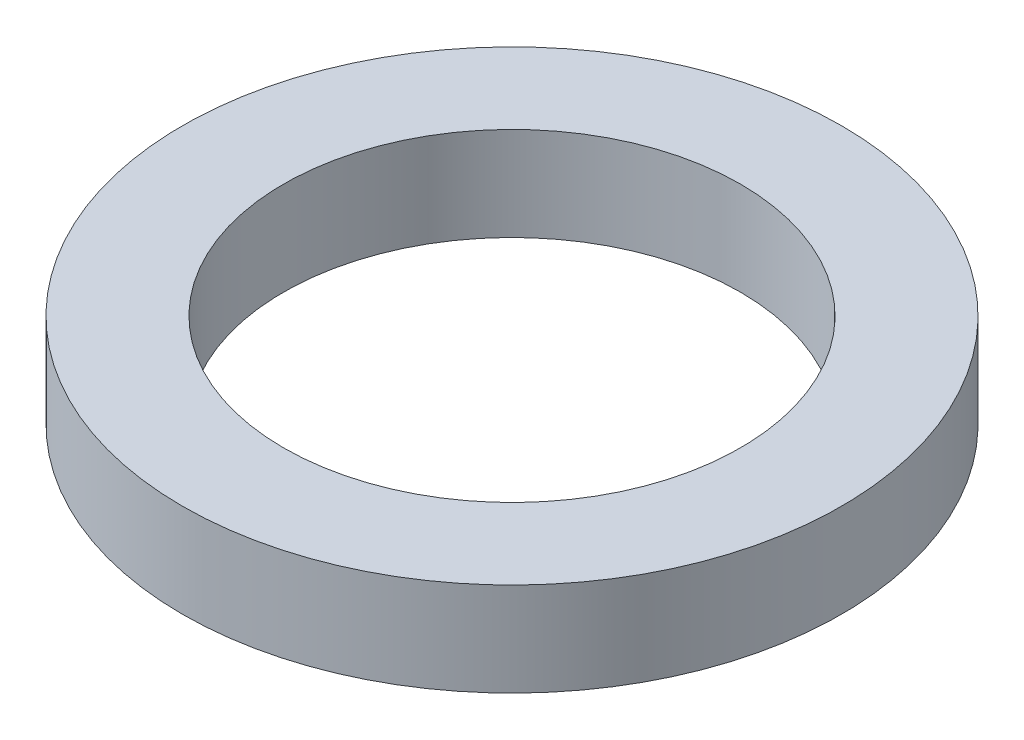
ISO-10303-21;
HEADER;
FILE_DESCRIPTION(('STEP AP214'),'2;1');
FILE_NAME('part.step','',(''),(''),'','','');
FILE_SCHEMA(('AUTOMOTIVE_DESIGN { 1 0 10303 214 1 1 1 1 }'));
ENDSEC;
DATA;
#1=APPLICATION_CONTEXT('core data for automotive mechanical design processes');
#2=APPLICATION_PROTOCOL_DEFINITION('international standard','automotive_design',2000,#1);
#3=PRODUCT_CONTEXT('',#1,'mechanical');
#4=PRODUCT('Part','Part','',(#3));
#5=PRODUCT_RELATED_PRODUCT_CATEGORY('part','',(#4));
#6=PRODUCT_DEFINITION_FORMATION('','',#4);
#7=PRODUCT_DEFINITION_CONTEXT('part definition',#1,'design');
#8=PRODUCT_DEFINITION('design','',#6,#7);
#9=PRODUCT_DEFINITION_SHAPE('','',#8);
#10=(LENGTH_UNIT() NAMED_UNIT(*) SI_UNIT(.MILLI.,.METRE.));
#11=(NAMED_UNIT(*) PLANE_ANGLE_UNIT() SI_UNIT($,.RADIAN.));
#12=(NAMED_UNIT(*) SI_UNIT($,.STERADIAN.) SOLID_ANGLE_UNIT());
#13=UNCERTAINTY_MEASURE_WITH_UNIT(LENGTH_MEASURE(1.E-05),#10,'distance_accuracy_value','');
#14=(GEOMETRIC_REPRESENTATION_CONTEXT(3) GLOBAL_UNCERTAINTY_ASSIGNED_CONTEXT((#13)) GLOBAL_UNIT_ASSIGNED_CONTEXT((#10,
#11,#12)) REPRESENTATION_CONTEXT('',''));
#15=CARTESIAN_POINT('',(0.,0.,0.));
#16=DIRECTION('',(0.,0.,1.));
#17=DIRECTION('',(1.,0.,0.));
#18=AXIS2_PLACEMENT_3D('',#15,#16,#17);
#19=CARTESIAN_POINT('',(0.,12.7,0.));
#20=DIRECTION('',(0.,-1.,0.));
#21=DIRECTION('',(0.,0.,-1.));
#22=AXIS2_PLACEMENT_3D('',#19,#20,#21);
#23=CYLINDRICAL_SURFACE('',#22,44.7167);
#24=CARTESIAN_POINT('',(0.,12.7,0.));
#25=DIRECTION('',(0.,1.,0.));
#26=DIRECTION('',(0.,0.,1.));
#27=AXIS2_PLACEMENT_3D('',#24,#25,#26);
#28=CIRCLE('',#27,44.7167);
#29=CARTESIAN_POINT('',(0.,12.7,44.7167));
#30=VERTEX_POINT('',#29);
#31=EDGE_CURVE('E10',#30,#30,#28,.T.);
#32=ORIENTED_EDGE('',*,*,#31,.F.);
#33=EDGE_LOOP('',(#32));
#34=FACE_BOUND('',#33,.T.);
#35=CARTESIAN_POINT('',(0.,0.,0.));
#36=DIRECTION('',(0.,1.,0.));
#37=DIRECTION('',(0.,0.,1.));
#38=AXIS2_PLACEMENT_3D('',#35,#36,#37);
#39=CIRCLE('',#38,44.7167);
#40=CARTESIAN_POINT('',(0.,0.,44.7167));
#41=VERTEX_POINT('',#40);
#42=EDGE_CURVE('E34',#41,#41,#39,.T.);
#43=ORIENTED_EDGE('',*,*,#42,.T.);
#44=EDGE_LOOP('',(#43));
#45=FACE_BOUND('',#44,.T.);
#46=ADVANCED_FACE('F31',(#34,#45),#23,.T.);
#47=CARTESIAN_POINT('',(0.,12.7,0.));
#48=DIRECTION('',(0.,1.,0.));
#49=DIRECTION('',(0.,0.,1.));
#50=AXIS2_PLACEMENT_3D('',#47,#48,#49);
#51=PLANE('',#50);
#52=CARTESIAN_POINT('',(0.,12.7,0.));
#53=DIRECTION('',(0.,1.,0.));
#54=DIRECTION('',(0.,0.,1.));
#55=AXIS2_PLACEMENT_3D('',#52,#53,#54);
#56=CIRCLE('',#55,31.);
#57=CARTESIAN_POINT('',(0.,12.7,31.));
#58=VERTEX_POINT('',#57);
#59=EDGE_CURVE('E41',#58,#58,#56,.T.);
#60=ORIENTED_EDGE('',*,*,#59,.F.);
#61=EDGE_LOOP('',(#60));
#62=FACE_BOUND('',#61,.T.);
#63=ORIENTED_EDGE('',*,*,#31,.T.);
#64=EDGE_LOOP('',(#63));
#65=FACE_BOUND('',#64,.T.);
#66=ADVANCED_FACE('F60',(#62,#65),#51,.T.);
#67=CARTESIAN_POINT('',(0.,0.,0.));
#68=DIRECTION('',(0.,1.,0.));
#69=DIRECTION('',(0.,0.,1.));
#70=AXIS2_PLACEMENT_3D('',#67,#68,#69);
#71=PLANE('',#70);
#72=CARTESIAN_POINT('',(0.,0.,0.));
#73=DIRECTION('',(0.,1.,0.));
#74=DIRECTION('',(0.,0.,1.));
#75=AXIS2_PLACEMENT_3D('',#72,#73,#74);
#76=CIRCLE('',#75,31.);
#77=CARTESIAN_POINT('',(0.,0.,31.));
#78=VERTEX_POINT('',#77);
#79=EDGE_CURVE('E45',#78,#78,#76,.T.);
#80=ORIENTED_EDGE('',*,*,#79,.T.);
#81=EDGE_LOOP('',(#80));
#82=FACE_BOUND('',#81,.T.);
#83=ORIENTED_EDGE('',*,*,#42,.F.);
#84=EDGE_LOOP('',(#83));
#85=FACE_BOUND('',#84,.T.);
#86=ADVANCED_FACE('F49',(#82,#85),#71,.F.);
#87=CARTESIAN_POINT('',(0.,12.701,0.));
#88=DIRECTION('',(0.,-1.,0.));
#89=DIRECTION('',(0.,0.,-1.));
#90=AXIS2_PLACEMENT_3D('',#87,#88,#89);
#91=CYLINDRICAL_SURFACE('',#90,31.);
#92=ORIENTED_EDGE('',*,*,#59,.T.);
#93=EDGE_LOOP('',(#92));
#94=FACE_BOUND('',#93,.T.);
#95=ORIENTED_EDGE('',*,*,#79,.F.);
#96=EDGE_LOOP('',(#95));
#97=FACE_BOUND('',#96,.T.);
#98=ADVANCED_FACE('F52',(#94,#97),#91,.F.);
#99=CLOSED_SHELL('',(#46,#66,#86,#98));
#100=MANIFOLD_SOLID_BREP('B2',#99);
#101=ADVANCED_BREP_SHAPE_REPRESENTATION('',(#18,#100),#14);
#102=SHAPE_DEFINITION_REPRESENTATION(#9,#101);
ENDSEC;
END-ISO-10303-21;
